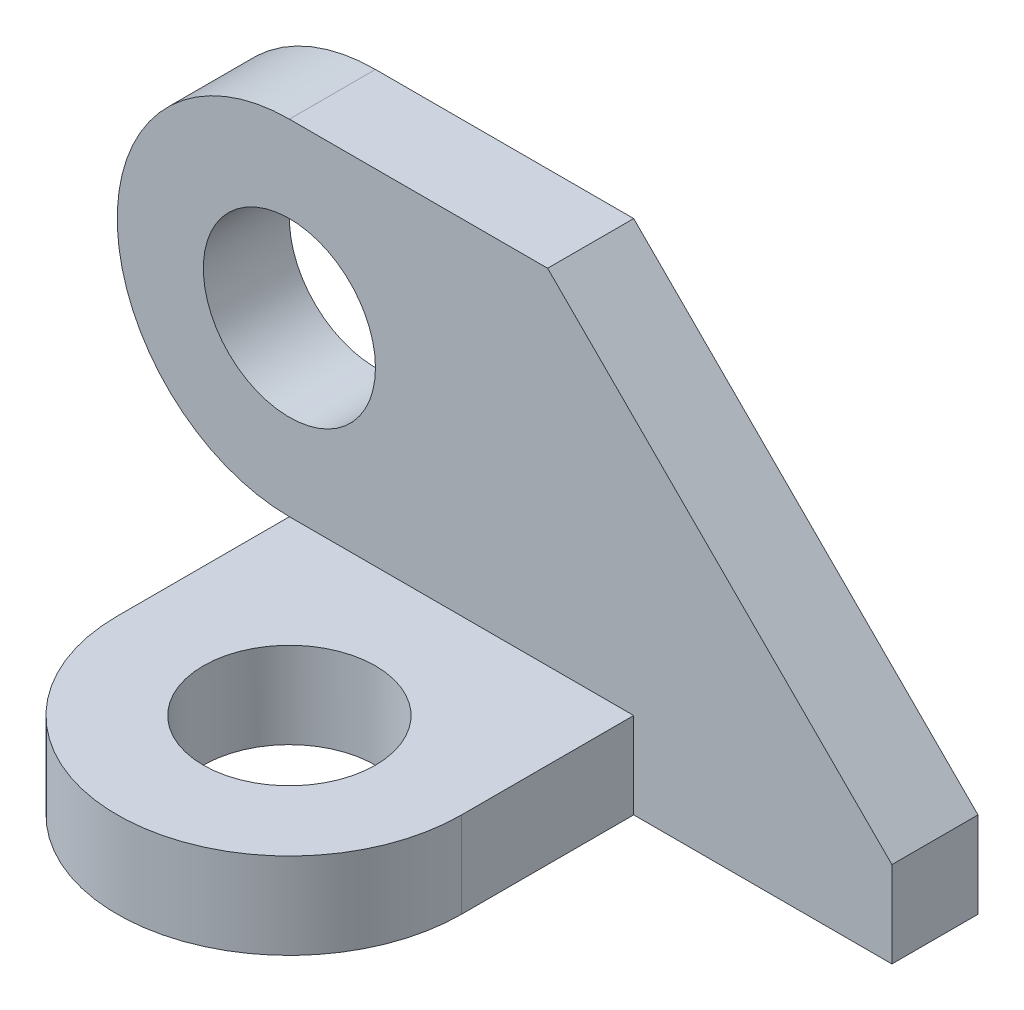
ISO-10303-21;
HEADER;
FILE_DESCRIPTION(('STEP AP214'),'2;1');
FILE_NAME('part.step','',(''),(''),'','','');
FILE_SCHEMA(('AUTOMOTIVE_DESIGN { 1 0 10303 214 1 1 1 1 }'));
ENDSEC;
DATA;
#1=APPLICATION_CONTEXT('core data for automotive mechanical design processes');
#2=APPLICATION_PROTOCOL_DEFINITION('international standard','automotive_design',2000,#1);
#3=PRODUCT_CONTEXT('',#1,'mechanical');
#4=PRODUCT('Part','Part','',(#3));
#5=PRODUCT_RELATED_PRODUCT_CATEGORY('part','',(#4));
#6=PRODUCT_DEFINITION_FORMATION('','',#4);
#7=PRODUCT_DEFINITION_CONTEXT('part definition',#1,'design');
#8=PRODUCT_DEFINITION('design','',#6,#7);
#9=PRODUCT_DEFINITION_SHAPE('','',#8);
#10=(LENGTH_UNIT() NAMED_UNIT(*) SI_UNIT(.MILLI.,.METRE.));
#11=(NAMED_UNIT(*) PLANE_ANGLE_UNIT() SI_UNIT($,.RADIAN.));
#12=(NAMED_UNIT(*) SI_UNIT($,.STERADIAN.) SOLID_ANGLE_UNIT());
#13=UNCERTAINTY_MEASURE_WITH_UNIT(LENGTH_MEASURE(1.E-05),#10,'distance_accuracy_value','');
#14=(GEOMETRIC_REPRESENTATION_CONTEXT(3) GLOBAL_UNCERTAINTY_ASSIGNED_CONTEXT((#13)) GLOBAL_UNIT_ASSIGNED_CONTEXT((#10,
#11,#12)) REPRESENTATION_CONTEXT('',''));
#15=CARTESIAN_POINT('',(0.,0.,0.));
#16=DIRECTION('',(0.,0.,1.));
#17=DIRECTION('',(1.,0.,0.));
#18=AXIS2_PLACEMENT_3D('',#15,#16,#17);
#19=CARTESIAN_POINT('',(0.,0.,5.));
#20=DIRECTION('',(0.,0.,1.));
#21=DIRECTION('',(1.,0.,0.));
#22=AXIS2_PLACEMENT_3D('',#19,#20,#21);
#23=PLANE('',#22);
#24=DIRECTION('',(-1.,0.,0.));
#25=VECTOR('',#24,1.);
#26=CARTESIAN_POINT('',(0.,-10.,5.));
#27=LINE('',#26,#25);
#28=CARTESIAN_POINT('',(20.,-10.,5.));
#29=VERTEX_POINT('',#28);
#30=CARTESIAN_POINT('',(0.,-10.,5.));
#31=VERTEX_POINT('',#30);
#32=EDGE_CURVE('E48',#29,#31,#27,.T.);
#33=ORIENTED_EDGE('',*,*,#32,.F.);
#34=DIRECTION('',(0.,-1.,0.));
#35=VECTOR('',#34,1.);
#36=CARTESIAN_POINT('',(20.,0.,5.));
#37=LINE('',#36,#35);
#38=CARTESIAN_POINT('',(20.,-15.,5.));
#39=VERTEX_POINT('',#38);
#40=EDGE_CURVE('E140',#29,#39,#37,.T.);
#41=ORIENTED_EDGE('',*,*,#40,.T.);
#42=DIRECTION('',(1.,0.,0.));
#43=VECTOR('',#42,1.);
#44=CARTESIAN_POINT('',(35.0000000000002,-15.,5.));
#45=LINE('',#44,#43);
#46=CARTESIAN_POINT('',(35.0000000000002,-15.,5.));
#47=VERTEX_POINT('',#46);
#48=EDGE_CURVE('E82',#39,#47,#45,.T.);
#49=ORIENTED_EDGE('',*,*,#48,.T.);
#50=DIRECTION('',(0.,1.,0.));
#51=VECTOR('',#50,1.);
#52=CARTESIAN_POINT('',(35.0000000000002,-10.,5.));
#53=LINE('',#52,#51);
#54=CARTESIAN_POINT('',(35.0000000000002,-10.,5.));
#55=VERTEX_POINT('',#54);
#56=EDGE_CURVE('E157',#47,#55,#53,.T.);
#57=ORIENTED_EDGE('',*,*,#56,.T.);
#58=DIRECTION('',(-0.707106781186552,0.707106781186543,0.));
#59=VECTOR('',#58,1.);
#60=CARTESIAN_POINT('',(15.,10.,5.));
#61=LINE('',#60,#59);
#62=CARTESIAN_POINT('',(15.,10.,5.));
#63=VERTEX_POINT('',#62);
#64=EDGE_CURVE('E159',#55,#63,#61,.T.);
#65=ORIENTED_EDGE('',*,*,#64,.T.);
#66=DIRECTION('',(-1.,0.,0.));
#67=VECTOR('',#66,1.);
#68=CARTESIAN_POINT('',(0.,10.,5.));
#69=LINE('',#68,#67);
#70=CARTESIAN_POINT('',(0.,10.,5.));
#71=VERTEX_POINT('',#70);
#72=EDGE_CURVE('E55',#63,#71,#69,.T.);
#73=ORIENTED_EDGE('',*,*,#72,.T.);
#74=CARTESIAN_POINT('',(0.,0.,5.));
#75=DIRECTION('',(0.,0.,1.));
#76=DIRECTION('',(1.,0.,0.));
#77=AXIS2_PLACEMENT_3D('',#74,#75,#76);
#78=CIRCLE('',#77,10.);
#79=EDGE_CURVE('E154',#71,#31,#78,.T.);
#80=ORIENTED_EDGE('',*,*,#79,.T.);
#81=EDGE_LOOP('',(#33,#41,#49,#57,#65,#73,#80));
#82=FACE_BOUND('',#81,.T.);
#83=CARTESIAN_POINT('',(0.,0.,5.));
#84=DIRECTION('',(0.,0.,1.));
#85=DIRECTION('',(1.,0.,0.));
#86=AXIS2_PLACEMENT_3D('',#83,#84,#85);
#87=CIRCLE('',#86,5.);
#88=CARTESIAN_POINT('',(5.,0.,5.));
#89=VERTEX_POINT('',#88);
#90=EDGE_CURVE('E148',#89,#89,#87,.T.);
#91=ORIENTED_EDGE('',*,*,#90,.F.);
#92=EDGE_LOOP('',(#91));
#93=FACE_BOUND('',#92,.T.);
#94=ADVANCED_FACE('F33',(#82,#93),#23,.T.);
#95=CARTESIAN_POINT('',(0.,0.,0.));
#96=DIRECTION('',(0.,0.,1.));
#97=DIRECTION('',(1.,0.,0.));
#98=AXIS2_PLACEMENT_3D('',#95,#96,#97);
#99=PLANE('',#98);
#100=DIRECTION('',(0.,-1.,0.));
#101=VECTOR('',#100,1.);
#102=CARTESIAN_POINT('',(0.,-10.,0.));
#103=LINE('',#102,#101);
#104=CARTESIAN_POINT('',(0.,-10.,0.));
#105=VERTEX_POINT('',#104);
#106=CARTESIAN_POINT('',(0.,-15.,0.));
#107=VERTEX_POINT('',#106);
#108=EDGE_CURVE('E144',#105,#107,#103,.T.);
#109=ORIENTED_EDGE('',*,*,#108,.F.);
#110=CARTESIAN_POINT('',(0.,0.,0.));
#111=DIRECTION('',(0.,0.,1.));
#112=DIRECTION('',(1.,0.,0.));
#113=AXIS2_PLACEMENT_3D('',#110,#111,#112);
#114=CIRCLE('',#113,10.);
#115=CARTESIAN_POINT('',(0.,10.,0.));
#116=VERTEX_POINT('',#115);
#117=EDGE_CURVE('E151',#116,#105,#114,.T.);
#118=ORIENTED_EDGE('',*,*,#117,.F.);
#119=DIRECTION('',(-1.,0.,0.));
#120=VECTOR('',#119,1.);
#121=CARTESIAN_POINT('',(0.,10.,0.));
#122=LINE('',#121,#120);
#123=CARTESIAN_POINT('',(15.,10.,0.));
#124=VERTEX_POINT('',#123);
#125=EDGE_CURVE('E76',#124,#116,#122,.T.);
#126=ORIENTED_EDGE('',*,*,#125,.F.);
#127=DIRECTION('',(-0.707106781186552,0.707106781186543,0.));
#128=VECTOR('',#127,1.);
#129=CARTESIAN_POINT('',(15.,10.,0.));
#130=LINE('',#129,#128);
#131=CARTESIAN_POINT('',(35.0000000000002,-10.,0.));
#132=VERTEX_POINT('',#131);
#133=EDGE_CURVE('E169',#132,#124,#130,.T.);
#134=ORIENTED_EDGE('',*,*,#133,.F.);
#135=DIRECTION('',(0.,1.,0.));
#136=VECTOR('',#135,1.);
#137=CARTESIAN_POINT('',(35.0000000000002,-10.,0.));
#138=LINE('',#137,#136);
#139=CARTESIAN_POINT('',(35.0000000000002,-15.,0.));
#140=VERTEX_POINT('',#139);
#141=EDGE_CURVE('E167',#140,#132,#138,.T.);
#142=ORIENTED_EDGE('',*,*,#141,.F.);
#143=DIRECTION('',(1.,0.,0.));
#144=VECTOR('',#143,1.);
#145=CARTESIAN_POINT('',(35.0000000000002,-15.,0.));
#146=LINE('',#145,#144);
#147=EDGE_CURVE('E165',#107,#140,#146,.T.);
#148=ORIENTED_EDGE('',*,*,#147,.F.);
#149=EDGE_LOOP('',(#109,#118,#126,#134,#142,#148));
#150=FACE_BOUND('',#149,.T.);
#151=CARTESIAN_POINT('',(0.,0.,0.));
#152=DIRECTION('',(0.,0.,1.));
#153=DIRECTION('',(1.,0.,0.));
#154=AXIS2_PLACEMENT_3D('',#151,#152,#153);
#155=CIRCLE('',#154,5.);
#156=CARTESIAN_POINT('',(5.,0.,0.));
#157=VERTEX_POINT('',#156);
#158=EDGE_CURVE('E147',#157,#157,#155,.T.);
#159=ORIENTED_EDGE('',*,*,#158,.T.);
#160=EDGE_LOOP('',(#159));
#161=FACE_BOUND('',#160,.T.);
#162=ADVANCED_FACE('F185',(#150,#161),#99,.F.);
#163=CARTESIAN_POINT('',(0.,0.,5.));
#164=DIRECTION('',(0.,0.,-1.));
#165=DIRECTION('',(-1.,0.,0.));
#166=AXIS2_PLACEMENT_3D('',#163,#164,#165);
#167=CYLINDRICAL_SURFACE('',#166,10.);
#168=ORIENTED_EDGE('',*,*,#117,.T.);
#169=DIRECTION('',(0.,0.,-1.));
#170=VECTOR('',#169,1.);
#171=CARTESIAN_POINT('',(0.,-10.,5.));
#172=LINE('',#171,#170);
#173=EDGE_CURVE('E11',#31,#105,#172,.T.);
#174=ORIENTED_EDGE('',*,*,#173,.F.);
#175=ORIENTED_EDGE('',*,*,#79,.F.);
#176=DIRECTION('',(0.,0.,-1.));
#177=VECTOR('',#176,1.);
#178=CARTESIAN_POINT('',(0.,10.,5.));
#179=LINE('',#178,#177);
#180=EDGE_CURVE('E162',#71,#116,#179,.T.);
#181=ORIENTED_EDGE('',*,*,#180,.T.);
#182=EDGE_LOOP('',(#168,#174,#175,#181));
#183=FACE_BOUND('',#182,.T.);
#184=ADVANCED_FACE('F35',(#183),#167,.T.);
#185=CARTESIAN_POINT('',(35.0000000000002,-15.,5.));
#186=DIRECTION('',(0.,1.,0.));
#187=DIRECTION('',(0.,0.,1.));
#188=AXIS2_PLACEMENT_3D('',#185,#186,#187);
#189=PLANE('',#188);
#190=ORIENTED_EDGE('',*,*,#147,.T.);
#191=DIRECTION('',(0.,0.,-1.));
#192=VECTOR('',#191,1.);
#193=CARTESIAN_POINT('',(35.0000000000002,-15.,5.));
#194=LINE('',#193,#192);
#195=EDGE_CURVE('E41',#47,#140,#194,.T.);
#196=ORIENTED_EDGE('',*,*,#195,.F.);
#197=ORIENTED_EDGE('',*,*,#48,.F.);
#198=DIRECTION('',(0.,0.,-1.));
#199=VECTOR('',#198,1.);
#200=CARTESIAN_POINT('',(20.,-15.,0.));
#201=LINE('',#200,#199);
#202=CARTESIAN_POINT('',(20.,-15.,15.));
#203=VERTEX_POINT('',#202);
#204=EDGE_CURVE('E108',#203,#39,#201,.T.);
#205=ORIENTED_EDGE('',*,*,#204,.F.);
#206=CARTESIAN_POINT('',(10.,-15.,15.));
#207=DIRECTION('',(0.,1.,0.));
#208=DIRECTION('',(0.,0.,1.));
#209=AXIS2_PLACEMENT_3D('',#206,#207,#208);
#210=CIRCLE('',#209,10.);
#211=CARTESIAN_POINT('',(0.,-15.,15.));
#212=VERTEX_POINT('',#211);
#213=EDGE_CURVE('E114',#212,#203,#210,.T.);
#214=ORIENTED_EDGE('',*,*,#213,.F.);
#215=DIRECTION('',(0.,0.,-1.));
#216=VECTOR('',#215,1.);
#217=CARTESIAN_POINT('',(0.,-15.,5.));
#218=LINE('',#217,#216);
#219=EDGE_CURVE('E142',#212,#107,#218,.T.);
#220=ORIENTED_EDGE('',*,*,#219,.T.);
#221=EDGE_LOOP('',(#190,#196,#197,#205,#214,#220));
#222=FACE_BOUND('',#221,.T.);
#223=CARTESIAN_POINT('',(10.,-15.,15.));
#224=DIRECTION('',(0.,1.,0.));
#225=DIRECTION('',(0.,0.,1.));
#226=AXIS2_PLACEMENT_3D('',#223,#224,#225);
#227=CIRCLE('',#226,5.);
#228=CARTESIAN_POINT('',(10.,-15.,20.));
#229=VERTEX_POINT('',#228);
#230=EDGE_CURVE('E135',#229,#229,#227,.T.);
#231=ORIENTED_EDGE('',*,*,#230,.T.);
#232=EDGE_LOOP('',(#231));
#233=FACE_BOUND('',#232,.T.);
#234=ADVANCED_FACE('F110',(#222,#233),#189,.F.);
#235=CARTESIAN_POINT('',(35.0000000000002,-10.,5.));
#236=DIRECTION('',(-1.,0.,0.));
#237=DIRECTION('',(0.,-1.,0.));
#238=AXIS2_PLACEMENT_3D('',#235,#236,#237);
#239=PLANE('',#238);
#240=ORIENTED_EDGE('',*,*,#141,.T.);
#241=DIRECTION('',(0.,0.,-1.));
#242=VECTOR('',#241,1.);
#243=CARTESIAN_POINT('',(35.0000000000002,-10.,5.));
#244=LINE('',#243,#242);
#245=EDGE_CURVE('E175',#55,#132,#244,.T.);
#246=ORIENTED_EDGE('',*,*,#245,.F.);
#247=ORIENTED_EDGE('',*,*,#56,.F.);
#248=ORIENTED_EDGE('',*,*,#195,.T.);
#249=EDGE_LOOP('',(#240,#246,#247,#248));
#250=FACE_BOUND('',#249,.T.);
#251=ADVANCED_FACE('F181',(#250),#239,.F.);
#252=CARTESIAN_POINT('',(15.,10.,5.));
#253=DIRECTION('',(-0.707106781186543,-0.707106781186552,0.));
#254=DIRECTION('',(0.707106781186552,-0.707106781186543,0.));
#255=AXIS2_PLACEMENT_3D('',#252,#253,#254);
#256=PLANE('',#255);
#257=ORIENTED_EDGE('',*,*,#133,.T.);
#258=DIRECTION('',(0.,0.,-1.));
#259=VECTOR('',#258,1.);
#260=CARTESIAN_POINT('',(15.,10.,5.));
#261=LINE('',#260,#259);
#262=EDGE_CURVE('E173',#63,#124,#261,.T.);
#263=ORIENTED_EDGE('',*,*,#262,.F.);
#264=ORIENTED_EDGE('',*,*,#64,.F.);
#265=ORIENTED_EDGE('',*,*,#245,.T.);
#266=EDGE_LOOP('',(#257,#263,#264,#265));
#267=FACE_BOUND('',#266,.T.);
#268=ADVANCED_FACE('F190',(#267),#256,.F.);
#269=CARTESIAN_POINT('',(0.,10.,5.));
#270=DIRECTION('',(0.,-1.,0.));
#271=DIRECTION('',(0.,0.,-1.));
#272=AXIS2_PLACEMENT_3D('',#269,#270,#271);
#273=PLANE('',#272);
#274=ORIENTED_EDGE('',*,*,#125,.T.);
#275=ORIENTED_EDGE('',*,*,#180,.F.);
#276=ORIENTED_EDGE('',*,*,#72,.F.);
#277=ORIENTED_EDGE('',*,*,#262,.T.);
#278=EDGE_LOOP('',(#274,#275,#276,#277));
#279=FACE_BOUND('',#278,.T.);
#280=ADVANCED_FACE('F192',(#279),#273,.F.);
#281=CARTESIAN_POINT('',(0.,0.,5.));
#282=DIRECTION('',(0.,0.,-1.));
#283=DIRECTION('',(-1.,0.,0.));
#284=AXIS2_PLACEMENT_3D('',#281,#282,#283);
#285=CYLINDRICAL_SURFACE('',#284,5.);
#286=ORIENTED_EDGE('',*,*,#90,.T.);
#287=EDGE_LOOP('',(#286));
#288=FACE_BOUND('',#287,.T.);
#289=ORIENTED_EDGE('',*,*,#158,.F.);
#290=EDGE_LOOP('',(#289));
#291=FACE_BOUND('',#290,.T.);
#292=ADVANCED_FACE('F201',(#288,#291),#285,.F.);
#293=CARTESIAN_POINT('',(0.,-10.,5.));
#294=DIRECTION('',(-1.,0.,0.));
#295=DIRECTION('',(0.,0.,1.));
#296=AXIS2_PLACEMENT_3D('',#293,#294,#295);
#297=PLANE('',#296);
#298=ORIENTED_EDGE('',*,*,#219,.F.);
#299=DIRECTION('',(0.,1.,0.));
#300=VECTOR('',#299,1.);
#301=CARTESIAN_POINT('',(0.,-47.0156211871642,15.));
#302=LINE('',#301,#300);
#303=CARTESIAN_POINT('',(0.,-10.,15.));
#304=VERTEX_POINT('',#303);
#305=EDGE_CURVE('E130',#212,#304,#302,.T.);
#306=ORIENTED_EDGE('',*,*,#305,.T.);
#307=DIRECTION('',(0.,0.,-1.));
#308=VECTOR('',#307,1.);
#309=CARTESIAN_POINT('',(0.,-10.,0.));
#310=LINE('',#309,#308);
#311=EDGE_CURVE('E138',#304,#31,#310,.T.);
#312=ORIENTED_EDGE('',*,*,#311,.T.);
#313=ORIENTED_EDGE('',*,*,#173,.T.);
#314=ORIENTED_EDGE('',*,*,#108,.T.);
#315=EDGE_LOOP('',(#298,#306,#312,#313,#314));
#316=FACE_BOUND('',#315,.T.);
#317=ADVANCED_FACE('F204',(#316),#297,.T.);
#318=CARTESIAN_POINT('',(10.,-10.,15.));
#319=DIRECTION('',(0.,1.,0.));
#320=DIRECTION('',(0.,0.,1.));
#321=AXIS2_PLACEMENT_3D('',#318,#319,#320);
#322=PLANE('',#321);
#323=DIRECTION('',(0.,0.,1.));
#324=VECTOR('',#323,1.);
#325=CARTESIAN_POINT('',(20.,-10.,0.));
#326=LINE('',#325,#324);
#327=CARTESIAN_POINT('',(20.,-10.,15.));
#328=VERTEX_POINT('',#327);
#329=EDGE_CURVE('E117',#29,#328,#326,.T.);
#330=ORIENTED_EDGE('',*,*,#329,.F.);
#331=ORIENTED_EDGE('',*,*,#32,.T.);
#332=ORIENTED_EDGE('',*,*,#311,.F.);
#333=CARTESIAN_POINT('',(10.,-10.,15.));
#334=DIRECTION('',(0.,-1.,0.));
#335=DIRECTION('',(0.,0.,1.));
#336=AXIS2_PLACEMENT_3D('',#333,#334,#335);
#337=CIRCLE('',#336,10.);
#338=EDGE_CURVE('E127',#328,#304,#337,.T.);
#339=ORIENTED_EDGE('',*,*,#338,.F.);
#340=EDGE_LOOP('',(#330,#331,#332,#339));
#341=FACE_BOUND('',#340,.T.);
#342=CARTESIAN_POINT('',(10.,-10.,15.));
#343=DIRECTION('',(0.,-1.,0.));
#344=DIRECTION('',(0.,0.,-1.));
#345=AXIS2_PLACEMENT_3D('',#342,#343,#344);
#346=CIRCLE('',#345,5.);
#347=CARTESIAN_POINT('',(10.,-10.,10.));
#348=VERTEX_POINT('',#347);
#349=EDGE_CURVE('E118',#348,#348,#346,.T.);
#350=ORIENTED_EDGE('',*,*,#349,.T.);
#351=EDGE_LOOP('',(#350));
#352=FACE_BOUND('',#351,.T.);
#353=ADVANCED_FACE('F246',(#341,#352),#322,.T.);
#354=CARTESIAN_POINT('',(20.,-47.0156211871642,0.));
#355=DIRECTION('',(-1.,0.,0.));
#356=DIRECTION('',(0.,0.,1.));
#357=AXIS2_PLACEMENT_3D('',#354,#355,#356);
#358=PLANE('',#357);
#359=ORIENTED_EDGE('',*,*,#40,.F.);
#360=ORIENTED_EDGE('',*,*,#329,.T.);
#361=DIRECTION('',(0.,1.,0.));
#362=VECTOR('',#361,1.);
#363=CARTESIAN_POINT('',(20.,-47.0156211871642,15.));
#364=LINE('',#363,#362);
#365=EDGE_CURVE('E121',#203,#328,#364,.T.);
#366=ORIENTED_EDGE('',*,*,#365,.F.);
#367=ORIENTED_EDGE('',*,*,#204,.T.);
#368=EDGE_LOOP('',(#359,#360,#366,#367));
#369=FACE_BOUND('',#368,.T.);
#370=ADVANCED_FACE('F122',(#369),#358,.F.);
#371=CARTESIAN_POINT('',(10.,-47.0156211871642,15.));
#372=DIRECTION('',(0.,1.,0.));
#373=DIRECTION('',(0.,0.,1.));
#374=AXIS2_PLACEMENT_3D('',#371,#372,#373);
#375=CYLINDRICAL_SURFACE('',#374,10.);
#376=ORIENTED_EDGE('',*,*,#305,.F.);
#377=ORIENTED_EDGE('',*,*,#213,.T.);
#378=ORIENTED_EDGE('',*,*,#365,.T.);
#379=ORIENTED_EDGE('',*,*,#338,.T.);
#380=EDGE_LOOP('',(#376,#377,#378,#379));
#381=FACE_BOUND('',#380,.T.);
#382=ADVANCED_FACE('F129',(#381),#375,.T.);
#383=CARTESIAN_POINT('',(10.,-47.0156211871642,15.));
#384=DIRECTION('',(0.,1.,0.));
#385=DIRECTION('',(0.,0.,1.));
#386=AXIS2_PLACEMENT_3D('',#383,#384,#385);
#387=CYLINDRICAL_SURFACE('',#386,5.);
#388=ORIENTED_EDGE('',*,*,#230,.F.);
#389=EDGE_LOOP('',(#388));
#390=FACE_BOUND('',#389,.T.);
#391=ORIENTED_EDGE('',*,*,#349,.F.);
#392=EDGE_LOOP('',(#391));
#393=FACE_BOUND('',#392,.T.);
#394=ADVANCED_FACE('F267',(#390,#393),#387,.F.);
#395=CLOSED_SHELL('',(#94,#162,#184,#234,#251,#268,#280,#292,#317,#353,#370,#382,#394));
#396=MANIFOLD_SOLID_BREP('B2',#395);
#397=ADVANCED_BREP_SHAPE_REPRESENTATION('',(#18,#396),#14);
#398=SHAPE_DEFINITION_REPRESENTATION(#9,#397);
ENDSEC;
END-ISO-10303-21;
